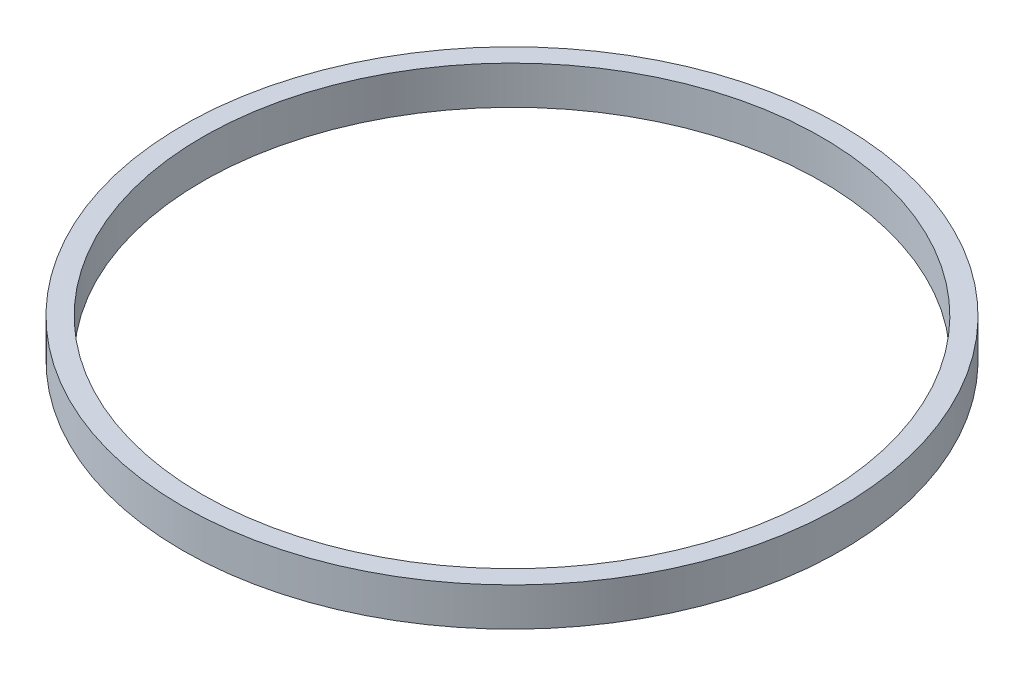
ISO-10303-21;
HEADER;
FILE_DESCRIPTION(('STEP AP214'),'2;1');
FILE_NAME('part.step','',(''),(''),'','','');
FILE_SCHEMA(('AUTOMOTIVE_DESIGN { 1 0 10303 214 1 1 1 1 }'));
ENDSEC;
DATA;
#1=APPLICATION_CONTEXT('core data for automotive mechanical design processes');
#2=APPLICATION_PROTOCOL_DEFINITION('international standard','automotive_design',2000,#1);
#3=PRODUCT_CONTEXT('',#1,'mechanical');
#4=PRODUCT('Part','Part','',(#3));
#5=PRODUCT_RELATED_PRODUCT_CATEGORY('part','',(#4));
#6=PRODUCT_DEFINITION_FORMATION('','',#4);
#7=PRODUCT_DEFINITION_CONTEXT('part definition',#1,'design');
#8=PRODUCT_DEFINITION('design','',#6,#7);
#9=PRODUCT_DEFINITION_SHAPE('','',#8);
#10=(LENGTH_UNIT() NAMED_UNIT(*) SI_UNIT(.MILLI.,.METRE.));
#11=(NAMED_UNIT(*) PLANE_ANGLE_UNIT() SI_UNIT($,.RADIAN.));
#12=(NAMED_UNIT(*) SI_UNIT($,.STERADIAN.) SOLID_ANGLE_UNIT());
#13=UNCERTAINTY_MEASURE_WITH_UNIT(LENGTH_MEASURE(1.E-05),#10,'distance_accuracy_value','');
#14=(GEOMETRIC_REPRESENTATION_CONTEXT(3) GLOBAL_UNCERTAINTY_ASSIGNED_CONTEXT((#13)) GLOBAL_UNIT_ASSIGNED_CONTEXT((#10,
#11,#12)) REPRESENTATION_CONTEXT('',''));
#15=CARTESIAN_POINT('',(0.,0.,0.));
#16=DIRECTION('',(0.,0.,1.));
#17=DIRECTION('',(1.,0.,0.));
#18=AXIS2_PLACEMENT_3D('',#15,#16,#17);
#19=CARTESIAN_POINT('',(0.,2.5,0.));
#20=DIRECTION('',(0.,1.,0.));
#21=DIRECTION('',(0.,0.,1.));
#22=AXIS2_PLACEMENT_3D('',#19,#20,#21);
#23=PLANE('',#22);
#24=CARTESIAN_POINT('',(0.,2.5,0.));
#25=DIRECTION('',(0.,1.,0.));
#26=DIRECTION('',(0.,0.,1.));
#27=AXIS2_PLACEMENT_3D('',#24,#25,#26);
#28=CIRCLE('',#27,21.5);
#29=CARTESIAN_POINT('',(0.,2.5,21.5));
#30=VERTEX_POINT('',#29);
#31=EDGE_CURVE('E10',#30,#30,#28,.T.);
#32=ORIENTED_EDGE('',*,*,#31,.T.);
#33=EDGE_LOOP('',(#32));
#34=FACE_BOUND('',#33,.T.);
#35=CARTESIAN_POINT('',(0.,2.5,0.));
#36=DIRECTION('',(0.,1.,0.));
#37=DIRECTION('',(0.,0.,1.));
#38=AXIS2_PLACEMENT_3D('',#35,#36,#37);
#39=CIRCLE('',#38,20.2);
#40=CARTESIAN_POINT('',(0.,2.5,20.2));
#41=VERTEX_POINT('',#40);
#42=EDGE_CURVE('E56',#41,#41,#39,.T.);
#43=ORIENTED_EDGE('',*,*,#42,.F.);
#44=EDGE_LOOP('',(#43));
#45=FACE_BOUND('',#44,.T.);
#46=ADVANCED_FACE('F43',(#34,#45),#23,.T.);
#47=CARTESIAN_POINT('',(0.,0.,0.));
#48=DIRECTION('',(0.,1.,0.));
#49=DIRECTION('',(0.,0.,1.));
#50=AXIS2_PLACEMENT_3D('',#47,#48,#49);
#51=PLANE('',#50);
#52=CARTESIAN_POINT('',(0.,0.,0.));
#53=DIRECTION('',(0.,1.,0.));
#54=DIRECTION('',(0.,0.,1.));
#55=AXIS2_PLACEMENT_3D('',#52,#53,#54);
#56=CIRCLE('',#55,21.5);
#57=CARTESIAN_POINT('',(0.,0.,21.5));
#58=VERTEX_POINT('',#57);
#59=EDGE_CURVE('E47',#58,#58,#56,.T.);
#60=ORIENTED_EDGE('',*,*,#59,.F.);
#61=EDGE_LOOP('',(#60));
#62=FACE_BOUND('',#61,.T.);
#63=CARTESIAN_POINT('',(0.,0.,0.));
#64=DIRECTION('',(0.,1.,0.));
#65=DIRECTION('',(0.,0.,1.));
#66=AXIS2_PLACEMENT_3D('',#63,#64,#65);
#67=CIRCLE('',#66,20.2);
#68=CARTESIAN_POINT('',(0.,0.,20.2));
#69=VERTEX_POINT('',#68);
#70=EDGE_CURVE('E58',#69,#69,#67,.T.);
#71=ORIENTED_EDGE('',*,*,#70,.T.);
#72=EDGE_LOOP('',(#71));
#73=FACE_BOUND('',#72,.T.);
#74=ADVANCED_FACE('F70',(#62,#73),#51,.F.);
#75=CARTESIAN_POINT('',(0.,2.5,0.));
#76=DIRECTION('',(0.,-1.,0.));
#77=DIRECTION('',(0.,0.,-1.));
#78=AXIS2_PLACEMENT_3D('',#75,#76,#77);
#79=CYLINDRICAL_SURFACE('',#78,21.5);
#80=ORIENTED_EDGE('',*,*,#31,.F.);
#81=EDGE_LOOP('',(#80));
#82=FACE_BOUND('',#81,.T.);
#83=ORIENTED_EDGE('',*,*,#59,.T.);
#84=EDGE_LOOP('',(#83));
#85=FACE_BOUND('',#84,.T.);
#86=ADVANCED_FACE('F45',(#82,#85),#79,.T.);
#87=CARTESIAN_POINT('',(0.,2.5,0.));
#88=DIRECTION('',(0.,-1.,0.));
#89=DIRECTION('',(0.,0.,-1.));
#90=AXIS2_PLACEMENT_3D('',#87,#88,#89);
#91=CYLINDRICAL_SURFACE('',#90,20.2);
#92=ORIENTED_EDGE('',*,*,#42,.T.);
#93=EDGE_LOOP('',(#92));
#94=FACE_BOUND('',#93,.T.);
#95=ORIENTED_EDGE('',*,*,#70,.F.);
#96=EDGE_LOOP('',(#95));
#97=FACE_BOUND('',#96,.T.);
#98=ADVANCED_FACE('F66',(#94,#97),#91,.F.);
#99=CLOSED_SHELL('',(#46,#74,#86,#98));
#100=MANIFOLD_SOLID_BREP('B2',#99);
#101=ADVANCED_BREP_SHAPE_REPRESENTATION('',(#18,#100),#14);
#102=SHAPE_DEFINITION_REPRESENTATION(#9,#101);
ENDSEC;
END-ISO-10303-21;
